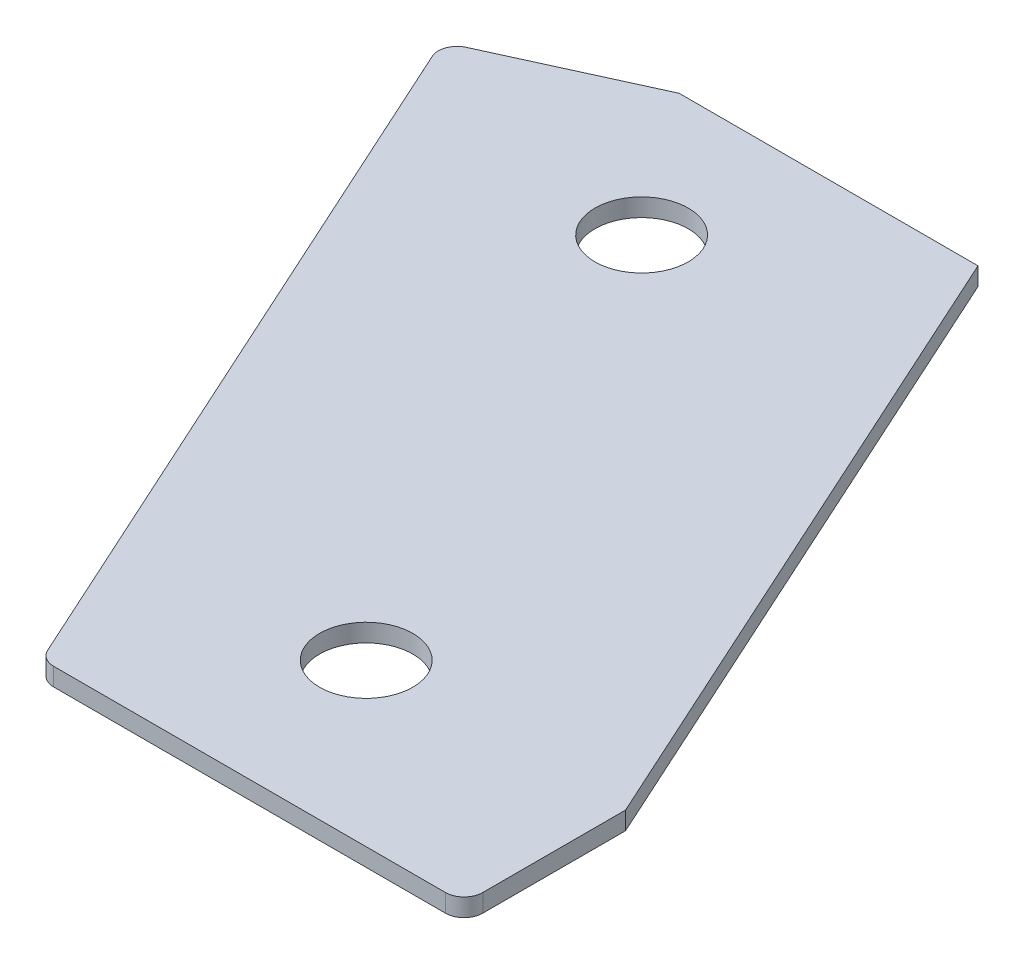
ISO-10303-21;
HEADER;
FILE_DESCRIPTION(('STEP AP214'),'2;1');
FILE_NAME('part.step','',(''),(''),'','','');
FILE_SCHEMA(('AUTOMOTIVE_DESIGN { 1 0 10303 214 1 1 1 1 }'));
ENDSEC;
DATA;
#1=APPLICATION_CONTEXT('core data for automotive mechanical design processes');
#2=APPLICATION_PROTOCOL_DEFINITION('international standard','automotive_design',2000,#1);
#3=PRODUCT_CONTEXT('',#1,'mechanical');
#4=PRODUCT('Part','Part','',(#3));
#5=PRODUCT_RELATED_PRODUCT_CATEGORY('part','',(#4));
#6=PRODUCT_DEFINITION_FORMATION('','',#4);
#7=PRODUCT_DEFINITION_CONTEXT('part definition',#1,'design');
#8=PRODUCT_DEFINITION('design','',#6,#7);
#9=PRODUCT_DEFINITION_SHAPE('','',#8);
#10=(LENGTH_UNIT() NAMED_UNIT(*) SI_UNIT(.MILLI.,.METRE.));
#11=(NAMED_UNIT(*) PLANE_ANGLE_UNIT() SI_UNIT($,.RADIAN.));
#12=(NAMED_UNIT(*) SI_UNIT($,.STERADIAN.) SOLID_ANGLE_UNIT());
#13=UNCERTAINTY_MEASURE_WITH_UNIT(LENGTH_MEASURE(1.E-05),#10,'distance_accuracy_value','');
#14=(GEOMETRIC_REPRESENTATION_CONTEXT(3) GLOBAL_UNCERTAINTY_ASSIGNED_CONTEXT((#13)) GLOBAL_UNIT_ASSIGNED_CONTEXT((#10,
#11,#12)) REPRESENTATION_CONTEXT('',''));
#15=CARTESIAN_POINT('',(0.,0.,0.));
#16=DIRECTION('',(0.,0.,1.));
#17=DIRECTION('',(1.,0.,0.));
#18=AXIS2_PLACEMENT_3D('',#15,#16,#17);
#19=CARTESIAN_POINT('',(67.9451209954108,5.,67.7379740400166));
#20=DIRECTION('',(-0.90996127087654,0.,0.414693242656246));
#21=DIRECTION('',(0.414693242656246,0.,0.90996127087654));
#22=AXIS2_PLACEMENT_3D('',#19,#20,#21);
#23=PLANE('',#22);
#24=DIRECTION('',(-0.414693242656246,0.,-0.90996127087654));
#25=VECTOR('',#24,1.);
#26=CARTESIAN_POINT('',(67.9451209954108,0.,67.7379740400166));
#27=LINE('',#26,#25);
#28=CARTESIAN_POINT('',(67.9451209954108,0.,67.7379740400166));
#29=VERTEX_POINT('',#28);
#30=CARTESIAN_POINT('',(-14.3025070367977,0.,-112.737974040017));
#31=VERTEX_POINT('',#30);
#32=EDGE_CURVE('E135',#29,#31,#27,.T.);
#33=ORIENTED_EDGE('',*,*,#32,.T.);
#34=DIRECTION('',(0.,-1.,0.));
#35=VECTOR('',#34,1.);
#36=CARTESIAN_POINT('',(-14.3025070367977,5.,-112.737974040017));
#37=LINE('',#36,#35);
#38=CARTESIAN_POINT('',(-14.3025070367977,5.,-112.737974040017));
#39=VERTEX_POINT('',#38);
#40=EDGE_CURVE('E11',#39,#31,#37,.T.);
#41=ORIENTED_EDGE('',*,*,#40,.F.);
#42=DIRECTION('',(-0.414693242656246,0.,-0.90996127087654));
#43=VECTOR('',#42,1.);
#44=CARTESIAN_POINT('',(67.9451209954108,5.,67.7379740400166));
#45=LINE('',#44,#43);
#46=CARTESIAN_POINT('',(67.9451209954108,5.,67.7379740400166));
#47=VERTEX_POINT('',#46);
#48=EDGE_CURVE('E152',#47,#39,#45,.T.);
#49=ORIENTED_EDGE('',*,*,#48,.F.);
#50=DIRECTION('',(0.,-1.,0.));
#51=VECTOR('',#50,1.);
#52=CARTESIAN_POINT('',(67.9451209954108,5.,67.7379740400166));
#53=LINE('',#52,#51);
#54=EDGE_CURVE('E131',#47,#29,#53,.T.);
#55=ORIENTED_EDGE('',*,*,#54,.T.);
#56=EDGE_LOOP('',(#33,#41,#49,#55));
#57=FACE_BOUND('',#56,.T.);
#58=ADVANCED_FACE('F33',(#57),#23,.F.);
#59=CARTESIAN_POINT('',(-97.5841637807547,5.,-112.737974040017));
#60=DIRECTION('',(0.,0.,1.));
#61=DIRECTION('',(1.,0.,0.));
#62=AXIS2_PLACEMENT_3D('',#59,#60,#61);
#63=PLANE('',#62);
#64=DIRECTION('',(-1.,0.,0.));
#65=VECTOR('',#64,1.);
#66=CARTESIAN_POINT('',(-97.5841637807547,0.,-112.737974040017));
#67=LINE('',#66,#65);
#68=CARTESIAN_POINT('',(-97.5841637807547,0.,-112.737974040017));
#69=VERTEX_POINT('',#68);
#70=EDGE_CURVE('E138',#31,#69,#67,.T.);
#71=ORIENTED_EDGE('',*,*,#70,.T.);
#72=DIRECTION('',(0.,-1.,0.));
#73=VECTOR('',#72,1.);
#74=CARTESIAN_POINT('',(-97.5841637807547,5.,-112.737974040017));
#75=LINE('',#74,#73);
#76=CARTESIAN_POINT('',(-97.5841637807547,5.,-112.737974040017));
#77=VERTEX_POINT('',#76);
#78=EDGE_CURVE('E41',#77,#69,#75,.T.);
#79=ORIENTED_EDGE('',*,*,#78,.F.);
#80=DIRECTION('',(-1.,0.,0.));
#81=VECTOR('',#80,1.);
#82=CARTESIAN_POINT('',(-97.5841637807547,5.,-112.737974040017));
#83=LINE('',#82,#81);
#84=EDGE_CURVE('E95',#39,#77,#83,.T.);
#85=ORIENTED_EDGE('',*,*,#84,.F.);
#86=ORIENTED_EDGE('',*,*,#40,.T.);
#87=EDGE_LOOP('',(#71,#79,#85,#86));
#88=FACE_BOUND('',#87,.T.);
#89=ADVANCED_FACE('F229',(#88),#63,.F.);
#90=CARTESIAN_POINT('',(-138.350428716024,5.,-94.1597167690169));
#91=DIRECTION('',(0.41469324265625,0.,0.909961270876538));
#92=DIRECTION('',(0.909961270876538,0.,-0.41469324265625));
#93=AXIS2_PLACEMENT_3D('',#90,#91,#92);
#94=PLANE('',#93);
#95=DIRECTION('',(-0.909961270876538,0.,0.41469324265625));
#96=VECTOR('',#95,1.);
#97=CARTESIAN_POINT('',(-138.350428716024,0.,-94.1597167690169));
#98=LINE('',#97,#96);
#99=CARTESIAN_POINT('',(-138.350428716024,0.,-94.1597167690169));
#100=VERTEX_POINT('',#99);
#101=EDGE_CURVE('E141',#69,#100,#98,.T.);
#102=ORIENTED_EDGE('',*,*,#101,.T.);
#103=DIRECTION('',(0.,-1.,0.));
#104=VECTOR('',#103,1.);
#105=CARTESIAN_POINT('',(-138.350428716024,5.,-94.1597167690169));
#106=LINE('',#105,#104);
#107=CARTESIAN_POINT('',(-138.350428716024,5.,-94.1597167690169));
#108=VERTEX_POINT('',#107);
#109=EDGE_CURVE('E162',#108,#100,#106,.T.);
#110=ORIENTED_EDGE('',*,*,#109,.F.);
#111=DIRECTION('',(-0.909961270876538,0.,0.41469324265625));
#112=VECTOR('',#111,1.);
#113=CARTESIAN_POINT('',(-138.350428716024,5.,-94.1597167690169));
#114=LINE('',#113,#112);
#115=EDGE_CURVE('E170',#77,#108,#114,.T.);
#116=ORIENTED_EDGE('',*,*,#115,.F.);
#117=ORIENTED_EDGE('',*,*,#78,.T.);
#118=EDGE_LOOP('',(#102,#110,#116,#117));
#119=FACE_BOUND('',#118,.T.);
#120=ADVANCED_FACE('F168',(#119),#94,.F.);
#121=CARTESIAN_POINT('',(-136.194023854211,5.,-89.4279181604589));
#122=DIRECTION('',(0.,-1.,0.));
#123=DIRECTION('',(0.,0.,-1.));
#124=AXIS2_PLACEMENT_3D('',#121,#122,#123);
#125=CYLINDRICAL_SURFACE('',#124,5.19999999999999);
#126=CARTESIAN_POINT('',(-136.194023854211,0.,-89.4279181604589));
#127=DIRECTION('',(0.,1.,0.));
#128=DIRECTION('',(0.,0.,1.));
#129=AXIS2_PLACEMENT_3D('',#126,#127,#128);
#130=CIRCLE('',#129,5.19999999999999);
#131=CARTESIAN_POINT('',(-140.925822462769,0.,-87.271513298646));
#132=VERTEX_POINT('',#131);
#133=EDGE_CURVE('E143',#100,#132,#130,.T.);
#134=ORIENTED_EDGE('',*,*,#133,.T.);
#135=DIRECTION('',(0.,-1.,0.));
#136=VECTOR('',#135,1.);
#137=CARTESIAN_POINT('',(-140.925822462769,5.,-87.271513298646));
#138=LINE('',#137,#136);
#139=CARTESIAN_POINT('',(-140.925822462769,5.,-87.271513298646));
#140=VERTEX_POINT('',#139);
#141=EDGE_CURVE('E159',#140,#132,#138,.T.);
#142=ORIENTED_EDGE('',*,*,#141,.F.);
#143=CARTESIAN_POINT('',(-136.194023854211,5.,-89.4279181604589));
#144=DIRECTION('',(0.,1.,0.));
#145=DIRECTION('',(0.,0.,1.));
#146=AXIS2_PLACEMENT_3D('',#143,#144,#145);
#147=CIRCLE('',#146,5.19999999999999);
#148=EDGE_CURVE('E186',#108,#140,#147,.T.);
#149=ORIENTED_EDGE('',*,*,#148,.F.);
#150=ORIENTED_EDGE('',*,*,#109,.T.);
#151=EDGE_LOOP('',(#134,#142,#149,#150));
#152=FACE_BOUND('',#151,.T.);
#153=ADVANCED_FACE('F179',(#152),#125,.T.);
#154=CARTESIAN_POINT('',(-51.1632939426096,5.,109.694378901829));
#155=DIRECTION('',(0.90996127087654,0.,-0.414693242656246));
#156=DIRECTION('',(-0.414693242656246,0.,-0.90996127087654));
#157=AXIS2_PLACEMENT_3D('',#154,#155,#156);
#158=PLANE('',#157);
#159=DIRECTION('',(0.414693242656246,0.,0.90996127087654));
#160=VECTOR('',#159,1.);
#161=CARTESIAN_POINT('',(-51.1632939426096,0.,109.694378901829));
#162=LINE('',#161,#160);
#163=CARTESIAN_POINT('',(-51.1632939426096,0.,109.694378901829));
#164=VERTEX_POINT('',#163);
#165=EDGE_CURVE('E145',#132,#164,#162,.T.);
#166=ORIENTED_EDGE('',*,*,#165,.T.);
#167=DIRECTION('',(0.,-1.,0.));
#168=VECTOR('',#167,1.);
#169=CARTESIAN_POINT('',(-51.1632939426096,5.,109.694378901829));
#170=LINE('',#169,#168);
#171=CARTESIAN_POINT('',(-51.1632939426096,5.,109.694378901829));
#172=VERTEX_POINT('',#171);
#173=EDGE_CURVE('E156',#172,#164,#170,.T.);
#174=ORIENTED_EDGE('',*,*,#173,.F.);
#175=DIRECTION('',(0.414693242656246,0.,0.90996127087654));
#176=VECTOR('',#175,1.);
#177=CARTESIAN_POINT('',(-51.1632939426096,5.,109.694378901829));
#178=LINE('',#177,#176);
#179=EDGE_CURVE('E185',#140,#172,#178,.T.);
#180=ORIENTED_EDGE('',*,*,#179,.F.);
#181=ORIENTED_EDGE('',*,*,#141,.T.);
#182=EDGE_LOOP('',(#166,#174,#180,#181));
#183=FACE_BOUND('',#182,.T.);
#184=ADVANCED_FACE('F183',(#183),#158,.F.);
#185=CARTESIAN_POINT('',(-46.4314953340516,5.,107.537974040017));
#186=DIRECTION('',(0.,-1.,0.));
#187=DIRECTION('',(0.,0.,-1.));
#188=AXIS2_PLACEMENT_3D('',#185,#186,#187);
#189=CYLINDRICAL_SURFACE('',#188,5.2);
#190=CARTESIAN_POINT('',(-46.4314953340516,0.,107.537974040017));
#191=DIRECTION('',(0.,1.,0.));
#192=DIRECTION('',(0.,0.,1.));
#193=AXIS2_PLACEMENT_3D('',#190,#191,#192);
#194=CIRCLE('',#193,5.2);
#195=CARTESIAN_POINT('',(-46.4314953340516,0.,112.737974040017));
#196=VERTEX_POINT('',#195);
#197=EDGE_CURVE('E147',#164,#196,#194,.T.);
#198=ORIENTED_EDGE('',*,*,#197,.T.);
#199=DIRECTION('',(0.,-1.,0.));
#200=VECTOR('',#199,1.);
#201=CARTESIAN_POINT('',(-46.4314953340516,5.,112.737974040017));
#202=LINE('',#201,#200);
#203=CARTESIAN_POINT('',(-46.4314953340516,5.,112.737974040017));
#204=VERTEX_POINT('',#203);
#205=EDGE_CURVE('E126',#204,#196,#202,.T.);
#206=ORIENTED_EDGE('',*,*,#205,.F.);
#207=CARTESIAN_POINT('',(-46.4314953340516,5.,107.537974040017));
#208=DIRECTION('',(0.,1.,0.));
#209=DIRECTION('',(0.,0.,1.));
#210=AXIS2_PLACEMENT_3D('',#207,#208,#209);
#211=CIRCLE('',#210,5.2);
#212=EDGE_CURVE('E117',#172,#204,#211,.T.);
#213=ORIENTED_EDGE('',*,*,#212,.F.);
#214=ORIENTED_EDGE('',*,*,#173,.T.);
#215=EDGE_LOOP('',(#198,#206,#213,#214));
#216=FACE_BOUND('',#215,.T.);
#217=ADVANCED_FACE('F237',(#216),#189,.T.);
#218=CARTESIAN_POINT('',(62.7451209954107,5.,112.737974040017));
#219=DIRECTION('',(0.,0.,-1.));
#220=DIRECTION('',(-1.,0.,0.));
#221=AXIS2_PLACEMENT_3D('',#218,#219,#220);
#222=PLANE('',#221);
#223=DIRECTION('',(1.,0.,0.));
#224=VECTOR('',#223,1.);
#225=CARTESIAN_POINT('',(62.7451209954107,0.,112.737974040017));
#226=LINE('',#225,#224);
#227=CARTESIAN_POINT('',(62.7451209954107,0.,112.737974040017));
#228=VERTEX_POINT('',#227);
#229=EDGE_CURVE('E125',#196,#228,#226,.T.);
#230=ORIENTED_EDGE('',*,*,#229,.T.);
#231=DIRECTION('',(0.,-1.,0.));
#232=VECTOR('',#231,1.);
#233=CARTESIAN_POINT('',(62.7451209954107,5.,112.737974040017));
#234=LINE('',#233,#232);
#235=CARTESIAN_POINT('',(62.7451209954107,5.,112.737974040017));
#236=VERTEX_POINT('',#235);
#237=EDGE_CURVE('E122',#236,#228,#234,.T.);
#238=ORIENTED_EDGE('',*,*,#237,.F.);
#239=DIRECTION('',(1.,0.,0.));
#240=VECTOR('',#239,1.);
#241=CARTESIAN_POINT('',(62.7451209954107,5.,112.737974040017));
#242=LINE('',#241,#240);
#243=EDGE_CURVE('E111',#204,#236,#242,.T.);
#244=ORIENTED_EDGE('',*,*,#243,.F.);
#245=ORIENTED_EDGE('',*,*,#205,.T.);
#246=EDGE_LOOP('',(#230,#238,#244,#245));
#247=FACE_BOUND('',#246,.T.);
#248=ADVANCED_FACE('F123',(#247),#222,.F.);
#249=CARTESIAN_POINT('',(62.7451209954108,5.,107.537974040017));
#250=DIRECTION('',(0.,-1.,0.));
#251=DIRECTION('',(0.,0.,-1.));
#252=AXIS2_PLACEMENT_3D('',#249,#250,#251);
#253=CYLINDRICAL_SURFACE('',#252,5.2);
#254=CARTESIAN_POINT('',(62.7451209954108,0.,107.537974040017));
#255=DIRECTION('',(0.,1.,0.));
#256=DIRECTION('',(0.,0.,1.));
#257=AXIS2_PLACEMENT_3D('',#254,#255,#256);
#258=CIRCLE('',#257,5.2);
#259=CARTESIAN_POINT('',(67.9451209954107,0.,107.537974040017));
#260=VERTEX_POINT('',#259);
#261=EDGE_CURVE('E81',#228,#260,#258,.T.);
#262=ORIENTED_EDGE('',*,*,#261,.T.);
#263=DIRECTION('',(0.,-1.,0.));
#264=VECTOR('',#263,1.);
#265=CARTESIAN_POINT('',(67.9451209954107,5.,107.537974040017));
#266=LINE('',#265,#264);
#267=CARTESIAN_POINT('',(67.9451209954107,5.,107.537974040017));
#268=VERTEX_POINT('',#267);
#269=EDGE_CURVE('E127',#268,#260,#266,.T.);
#270=ORIENTED_EDGE('',*,*,#269,.F.);
#271=CARTESIAN_POINT('',(62.7451209954108,5.,107.537974040017));
#272=DIRECTION('',(0.,1.,0.));
#273=DIRECTION('',(0.,0.,1.));
#274=AXIS2_PLACEMENT_3D('',#271,#272,#273);
#275=CIRCLE('',#274,5.2);
#276=EDGE_CURVE('E115',#236,#268,#275,.T.);
#277=ORIENTED_EDGE('',*,*,#276,.F.);
#278=ORIENTED_EDGE('',*,*,#237,.T.);
#279=EDGE_LOOP('',(#262,#270,#277,#278));
#280=FACE_BOUND('',#279,.T.);
#281=ADVANCED_FACE('F129',(#280),#253,.T.);
#282=CARTESIAN_POINT('',(67.9451209954108,5.,67.7379740400166));
#283=DIRECTION('',(-1.,0.,0.));
#284=DIRECTION('',(0.,0.,1.));
#285=AXIS2_PLACEMENT_3D('',#282,#283,#284);
#286=PLANE('',#285);
#287=DIRECTION('',(0.,0.,-1.));
#288=VECTOR('',#287,1.);
#289=CARTESIAN_POINT('',(67.9451209954108,0.,67.7379740400166));
#290=LINE('',#289,#288);
#291=EDGE_CURVE('E87',#260,#29,#290,.T.);
#292=ORIENTED_EDGE('',*,*,#291,.T.);
#293=ORIENTED_EDGE('',*,*,#54,.F.);
#294=DIRECTION('',(0.,0.,-1.));
#295=VECTOR('',#294,1.);
#296=CARTESIAN_POINT('',(67.9451209954108,5.,67.7379740400166));
#297=LINE('',#296,#295);
#298=EDGE_CURVE('E49',#268,#47,#297,.T.);
#299=ORIENTED_EDGE('',*,*,#298,.F.);
#300=ORIENTED_EDGE('',*,*,#269,.T.);
#301=EDGE_LOOP('',(#292,#293,#299,#300));
#302=FACE_BOUND('',#301,.T.);
#303=ADVANCED_FACE('F216',(#302),#286,.F.);
#304=CARTESIAN_POINT('',(-136.194023854211,5.,-89.4279181604589));
#305=DIRECTION('',(0.,1.,0.));
#306=DIRECTION('',(0.,0.,1.));
#307=AXIS2_PLACEMENT_3D('',#304,#305,#306);
#308=PLANE('',#307);
#309=CARTESIAN_POINT('',(-4.34705705307654,5.,67.7379740400169));
#310=DIRECTION('',(0.,1.,0.));
#311=DIRECTION('',(0.,0.,1.));
#312=AXIS2_PLACEMENT_3D('',#309,#310,#311);
#313=CIRCLE('',#312,13.);
#314=CARTESIAN_POINT('',(-4.34705705307654,5.,80.7379740400169));
#315=VERTEX_POINT('',#314);
#316=EDGE_CURVE('E199',#315,#315,#313,.T.);
#317=ORIENTED_EDGE('',*,*,#316,.F.);
#318=EDGE_LOOP('',(#317));
#319=FACE_BOUND('',#318,.T.);
#320=CARTESIAN_POINT('',(-68.6245096647947,5.,-73.3060229458467));
#321=DIRECTION('',(0.,1.,0.));
#322=DIRECTION('',(0.,0.,1.));
#323=AXIS2_PLACEMENT_3D('',#320,#321,#322);
#324=CIRCLE('',#323,13.);
#325=CARTESIAN_POINT('',(-68.6245096647947,5.,-60.3060229458467));
#326=VERTEX_POINT('',#325);
#327=EDGE_CURVE('E193',#326,#326,#324,.T.);
#328=ORIENTED_EDGE('',*,*,#327,.F.);
#329=EDGE_LOOP('',(#328));
#330=FACE_BOUND('',#329,.T.);
#331=ORIENTED_EDGE('',*,*,#48,.T.);
#332=ORIENTED_EDGE('',*,*,#84,.T.);
#333=ORIENTED_EDGE('',*,*,#115,.T.);
#334=ORIENTED_EDGE('',*,*,#148,.T.);
#335=ORIENTED_EDGE('',*,*,#179,.T.);
#336=ORIENTED_EDGE('',*,*,#212,.T.);
#337=ORIENTED_EDGE('',*,*,#243,.T.);
#338=ORIENTED_EDGE('',*,*,#276,.T.);
#339=ORIENTED_EDGE('',*,*,#298,.T.);
#340=EDGE_LOOP('',(#331,#332,#333,#334,#335,#336,#337,#338,#339));
#341=FACE_BOUND('',#340,.T.);
#342=ADVANCED_FACE('F113',(#319,#330,#341),#308,.T.);
#343=CARTESIAN_POINT('',(-136.194023854211,0.,-89.4279181604589));
#344=DIRECTION('',(0.,1.,0.));
#345=DIRECTION('',(0.,0.,1.));
#346=AXIS2_PLACEMENT_3D('',#343,#344,#345);
#347=PLANE('',#346);
#348=CARTESIAN_POINT('',(-4.34705705307654,0.,67.7379740400169));
#349=DIRECTION('',(0.,1.,0.));
#350=DIRECTION('',(0.,0.,1.));
#351=AXIS2_PLACEMENT_3D('',#348,#349,#350);
#352=CIRCLE('',#351,13.);
#353=CARTESIAN_POINT('',(-4.34705705307654,0.,80.7379740400169));
#354=VERTEX_POINT('',#353);
#355=EDGE_CURVE('E139',#354,#354,#352,.T.);
#356=ORIENTED_EDGE('',*,*,#355,.T.);
#357=EDGE_LOOP('',(#356));
#358=FACE_BOUND('',#357,.T.);
#359=CARTESIAN_POINT('',(-68.6245096647947,0.,-73.3060229458467));
#360=DIRECTION('',(0.,1.,0.));
#361=DIRECTION('',(0.,0.,1.));
#362=AXIS2_PLACEMENT_3D('',#359,#360,#361);
#363=CIRCLE('',#362,13.);
#364=CARTESIAN_POINT('',(-68.6245096647947,0.,-60.3060229458467));
#365=VERTEX_POINT('',#364);
#366=EDGE_CURVE('E196',#365,#365,#363,.T.);
#367=ORIENTED_EDGE('',*,*,#366,.T.);
#368=EDGE_LOOP('',(#367));
#369=FACE_BOUND('',#368,.T.);
#370=ORIENTED_EDGE('',*,*,#32,.F.);
#371=ORIENTED_EDGE('',*,*,#291,.F.);
#372=ORIENTED_EDGE('',*,*,#261,.F.);
#373=ORIENTED_EDGE('',*,*,#229,.F.);
#374=ORIENTED_EDGE('',*,*,#197,.F.);
#375=ORIENTED_EDGE('',*,*,#165,.F.);
#376=ORIENTED_EDGE('',*,*,#133,.F.);
#377=ORIENTED_EDGE('',*,*,#101,.F.);
#378=ORIENTED_EDGE('',*,*,#70,.F.);
#379=EDGE_LOOP('',(#370,#371,#372,#373,#374,#375,#376,#377,#378));
#380=FACE_BOUND('',#379,.T.);
#381=ADVANCED_FACE('F174',(#358,#369,#380),#347,.F.);
#382=CARTESIAN_POINT('',(-68.6245096647947,0.,-73.3060229458467));
#383=DIRECTION('',(0.,1.,0.));
#384=DIRECTION('',(0.,0.,1.));
#385=AXIS2_PLACEMENT_3D('',#382,#383,#384);
#386=CYLINDRICAL_SURFACE('',#385,13.);
#387=ORIENTED_EDGE('',*,*,#366,.F.);
#388=EDGE_LOOP('',(#387));
#389=FACE_BOUND('',#388,.T.);
#390=ORIENTED_EDGE('',*,*,#327,.T.);
#391=EDGE_LOOP('',(#390));
#392=FACE_BOUND('',#391,.T.);
#393=ADVANCED_FACE('F210',(#389,#392),#386,.F.);
#394=CARTESIAN_POINT('',(-4.34705705307654,0.,67.7379740400169));
#395=DIRECTION('',(0.,1.,0.));
#396=DIRECTION('',(0.,0.,1.));
#397=AXIS2_PLACEMENT_3D('',#394,#395,#396);
#398=CYLINDRICAL_SURFACE('',#397,13.);
#399=ORIENTED_EDGE('',*,*,#355,.F.);
#400=EDGE_LOOP('',(#399));
#401=FACE_BOUND('',#400,.T.);
#402=ORIENTED_EDGE('',*,*,#316,.T.);
#403=EDGE_LOOP('',(#402));
#404=FACE_BOUND('',#403,.T.);
#405=ADVANCED_FACE('F207',(#401,#404),#398,.F.);
#406=CLOSED_SHELL('',(#58,#89,#120,#153,#184,#217,#248,#281,#303,#342,#381,#393,#405));
#407=MANIFOLD_SOLID_BREP('B2',#406);
#408=ADVANCED_BREP_SHAPE_REPRESENTATION('',(#18,#407),#14);
#409=SHAPE_DEFINITION_REPRESENTATION(#9,#408);
ENDSEC;
END-ISO-10303-21;
